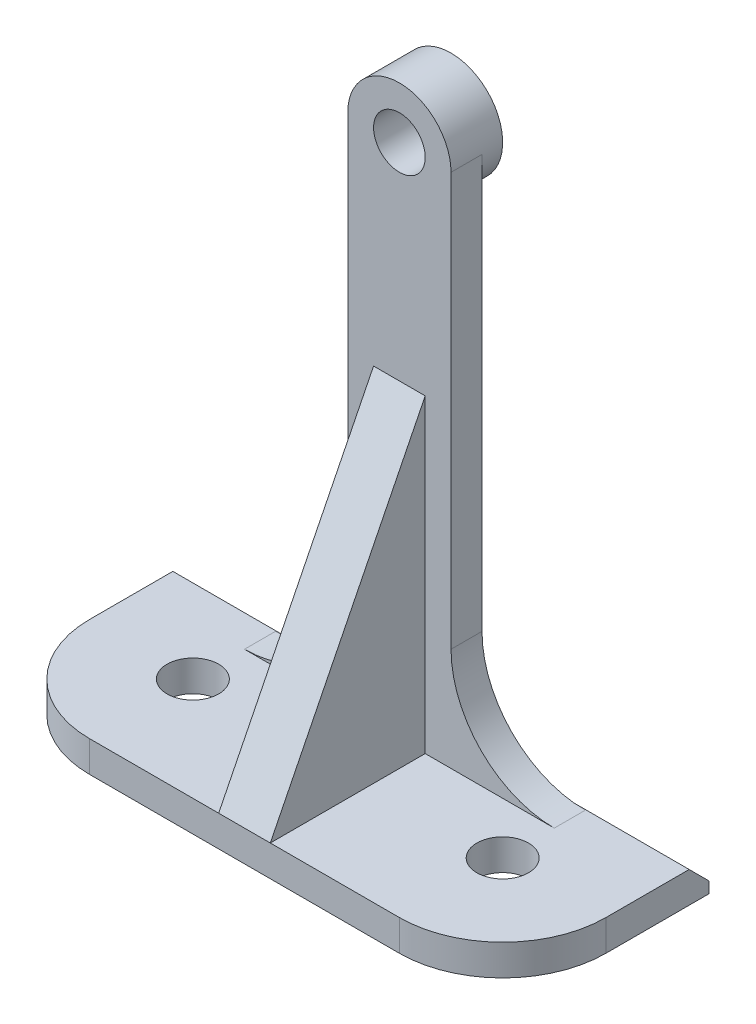
ISO-10303-21;
HEADER;
FILE_DESCRIPTION(('STEP AP214'),'2;1');
FILE_NAME('part.step','',(''),(''),'','','');
FILE_SCHEMA(('AUTOMOTIVE_DESIGN { 1 0 10303 214 1 1 1 1 }'));
ENDSEC;
DATA;
#1=APPLICATION_CONTEXT('core data for automotive mechanical design processes');
#2=APPLICATION_PROTOCOL_DEFINITION('international standard','automotive_design',2000,#1);
#3=PRODUCT_CONTEXT('',#1,'mechanical');
#4=PRODUCT('Part','Part','',(#3));
#5=PRODUCT_RELATED_PRODUCT_CATEGORY('part','',(#4));
#6=PRODUCT_DEFINITION_FORMATION('','',#4);
#7=PRODUCT_DEFINITION_CONTEXT('part definition',#1,'design');
#8=PRODUCT_DEFINITION('design','',#6,#7);
#9=PRODUCT_DEFINITION_SHAPE('','',#8);
#10=(LENGTH_UNIT() NAMED_UNIT(*) SI_UNIT(.MILLI.,.METRE.));
#11=(NAMED_UNIT(*) PLANE_ANGLE_UNIT() SI_UNIT($,.RADIAN.));
#12=(NAMED_UNIT(*) SI_UNIT($,.STERADIAN.) SOLID_ANGLE_UNIT());
#13=UNCERTAINTY_MEASURE_WITH_UNIT(LENGTH_MEASURE(1.E-05),#10,'distance_accuracy_value','');
#14=(GEOMETRIC_REPRESENTATION_CONTEXT(3) GLOBAL_UNCERTAINTY_ASSIGNED_CONTEXT((#13)) GLOBAL_UNIT_ASSIGNED_CONTEXT((#10,
#11,#12)) REPRESENTATION_CONTEXT('',''));
#15=CARTESIAN_POINT('',(0.,0.,0.));
#16=DIRECTION('',(0.,0.,1.));
#17=DIRECTION('',(1.,0.,0.));
#18=AXIS2_PLACEMENT_3D('',#15,#16,#17);
#19=CARTESIAN_POINT('',(0.,0.,-20.32));
#20=DIRECTION('',(0.,0.,-1.));
#21=DIRECTION('',(-1.,0.,0.));
#22=AXIS2_PLACEMENT_3D('',#19,#20,#21);
#23=PLANE('',#22);
#24=CARTESIAN_POINT('',(38.1,33.02,-20.32));
#25=DIRECTION('',(0.,0.,-1.));
#26=DIRECTION('',(-1.,0.,0.));
#27=AXIS2_PLACEMENT_3D('',#24,#25,#26);
#28=CIRCLE('',#27,25.4);
#29=CARTESIAN_POINT('',(12.7,33.02,-20.32));
#30=VERTEX_POINT('',#29);
#31=CARTESIAN_POINT('',(38.1,7.62,-20.32));
#32=VERTEX_POINT('',#31);
#33=EDGE_CURVE('E226',#30,#32,#28,.F.);
#34=ORIENTED_EDGE('',*,*,#33,.T.);
#35=DIRECTION('',(1.,0.,0.));
#36=VECTOR('',#35,1.);
#37=CARTESIAN_POINT('',(0.,7.62,-20.32));
#38=LINE('',#37,#36);
#39=CARTESIAN_POINT('',(-38.1,7.62,-20.32));
#40=VERTEX_POINT('',#39);
#41=EDGE_CURVE('E276',#40,#32,#38,.T.);
#42=ORIENTED_EDGE('',*,*,#41,.F.);
#43=CARTESIAN_POINT('',(-38.1,33.02,-20.32));
#44=DIRECTION('',(0.,0.,-1.));
#45=DIRECTION('',(-1.,0.,0.));
#46=AXIS2_PLACEMENT_3D('',#43,#44,#45);
#47=CIRCLE('',#46,25.4);
#48=CARTESIAN_POINT('',(-12.7,33.02,-20.32));
#49=VERTEX_POINT('',#48);
#50=EDGE_CURVE('E270',#40,#49,#47,.F.);
#51=ORIENTED_EDGE('',*,*,#50,.T.);
#52=DIRECTION('',(0.,-1.,0.));
#53=VECTOR('',#52,1.);
#54=CARTESIAN_POINT('',(-12.7,0.,-20.32));
#55=LINE('',#54,#53);
#56=CARTESIAN_POINT('',(-12.7,134.62,-20.32));
#57=VERTEX_POINT('',#56);
#58=EDGE_CURVE('E289',#57,#49,#55,.T.);
#59=ORIENTED_EDGE('',*,*,#58,.F.);
#60=CARTESIAN_POINT('',(0.,134.62,-20.32));
#61=DIRECTION('',(0.,0.,-1.));
#62=DIRECTION('',(-1.,0.,0.));
#63=AXIS2_PLACEMENT_3D('',#60,#61,#62);
#64=CIRCLE('',#63,12.7);
#65=CARTESIAN_POINT('',(12.7,134.62,-20.32));
#66=VERTEX_POINT('',#65);
#67=EDGE_CURVE('E257',#57,#66,#64,.F.);
#68=ORIENTED_EDGE('',*,*,#67,.T.);
#69=DIRECTION('',(0.,-1.,0.));
#70=VECTOR('',#69,1.);
#71=CARTESIAN_POINT('',(12.7,0.,-20.32));
#72=LINE('',#71,#70);
#73=EDGE_CURVE('E278',#66,#30,#72,.T.);
#74=ORIENTED_EDGE('',*,*,#73,.T.);
#75=EDGE_LOOP('',(#34,#42,#51,#59,#68,#74));
#76=FACE_BOUND('',#75,.T.);
#77=ADVANCED_FACE('F80',(#76),#23,.T.);
#78=CARTESIAN_POINT('',(38.1,7.62,0.));
#79=DIRECTION('',(0.,1.,0.));
#80=DIRECTION('',(0.,0.,1.));
#81=AXIS2_PLACEMENT_3D('',#78,#79,#80);
#82=PLANE('',#81);
#83=DIRECTION('',(0.,0.,1.));
#84=VECTOR('',#83,1.);
#85=CARTESIAN_POINT('',(63.5,7.62,-25.4));
#86=LINE('',#85,#84);
#87=CARTESIAN_POINT('',(63.5,7.62,-20.48));
#88=VERTEX_POINT('',#87);
#89=CARTESIAN_POINT('',(63.5,7.62,0.));
#90=VERTEX_POINT('',#89);
#91=EDGE_CURVE('E311',#88,#90,#86,.T.);
#92=ORIENTED_EDGE('',*,*,#91,.F.);
#93=DIRECTION('',(-1.,0.,0.));
#94=VECTOR('',#93,1.);
#95=CARTESIAN_POINT('',(38.1,7.62,-20.48));
#96=LINE('',#95,#94);
#97=CARTESIAN_POINT('',(-63.5,7.62,-20.48));
#98=VERTEX_POINT('',#97);
#99=EDGE_CURVE('E89',#88,#98,#96,.T.);
#100=ORIENTED_EDGE('',*,*,#99,.T.);
#101=DIRECTION('',(0.,0.,1.));
#102=VECTOR('',#101,1.);
#103=CARTESIAN_POINT('',(-63.5,7.62,-25.4));
#104=LINE('',#103,#102);
#105=CARTESIAN_POINT('',(-63.5,7.62,0.));
#106=VERTEX_POINT('',#105);
#107=EDGE_CURVE('E249',#98,#106,#104,.T.);
#108=ORIENTED_EDGE('',*,*,#107,.T.);
#109=CARTESIAN_POINT('',(-38.1,7.62,0.));
#110=DIRECTION('',(0.,1.,0.));
#111=DIRECTION('',(0.,0.,1.));
#112=AXIS2_PLACEMENT_3D('',#109,#110,#111);
#113=CIRCLE('',#112,25.4);
#114=CARTESIAN_POINT('',(-38.1,7.62,25.4));
#115=VERTEX_POINT('',#114);
#116=EDGE_CURVE('E253',#106,#115,#113,.T.);
#117=ORIENTED_EDGE('',*,*,#116,.T.);
#118=DIRECTION('',(1.,0.,0.));
#119=VECTOR('',#118,1.);
#120=CARTESIAN_POINT('',(-38.1,7.62,25.4));
#121=LINE('',#120,#119);
#122=CARTESIAN_POINT('',(-6.35,7.62,25.4));
#123=VERTEX_POINT('',#122);
#124=EDGE_CURVE('E212',#115,#123,#121,.T.);
#125=ORIENTED_EDGE('',*,*,#124,.T.);
#126=DIRECTION('',(0.,0.,-1.));
#127=VECTOR('',#126,1.);
#128=CARTESIAN_POINT('',(-6.35,7.62,0.));
#129=LINE('',#128,#127);
#130=CARTESIAN_POINT('',(-6.35,7.62,-12.7));
#131=VERTEX_POINT('',#130);
#132=EDGE_CURVE('E208',#123,#131,#129,.T.);
#133=ORIENTED_EDGE('',*,*,#132,.T.);
#134=DIRECTION('',(1.,0.,0.));
#135=VECTOR('',#134,1.);
#136=CARTESIAN_POINT('',(0.,7.62,-12.7));
#137=LINE('',#136,#135);
#138=CARTESIAN_POINT('',(-38.1,7.62,-12.7));
#139=VERTEX_POINT('',#138);
#140=EDGE_CURVE('E191',#139,#131,#137,.T.);
#141=ORIENTED_EDGE('',*,*,#140,.F.);
#142=DIRECTION('',(0.,0.,-1.));
#143=VECTOR('',#142,1.);
#144=CARTESIAN_POINT('',(-38.1,7.62,0.));
#145=LINE('',#144,#143);
#146=EDGE_CURVE('E263',#139,#40,#145,.T.);
#147=ORIENTED_EDGE('',*,*,#146,.T.);
#148=ORIENTED_EDGE('',*,*,#41,.T.);
#149=DIRECTION('',(0.,0.,-1.));
#150=VECTOR('',#149,1.);
#151=CARTESIAN_POINT('',(38.1,7.62,-12.7));
#152=LINE('',#151,#150);
#153=CARTESIAN_POINT('',(38.1,7.62,-12.7));
#154=VERTEX_POINT('',#153);
#155=EDGE_CURVE('E260',#32,#154,#152,.F.);
#156=ORIENTED_EDGE('',*,*,#155,.T.);
#157=CARTESIAN_POINT('',(6.35,7.62,-12.7));
#158=VERTEX_POINT('',#157);
#159=EDGE_CURVE('E204',#158,#154,#137,.T.);
#160=ORIENTED_EDGE('',*,*,#159,.F.);
#161=DIRECTION('',(0.,0.,-1.));
#162=VECTOR('',#161,1.);
#163=CARTESIAN_POINT('',(6.35,7.62,0.));
#164=LINE('',#163,#162);
#165=CARTESIAN_POINT('',(6.35,7.62,25.4));
#166=VERTEX_POINT('',#165);
#167=EDGE_CURVE('E216',#166,#158,#164,.T.);
#168=ORIENTED_EDGE('',*,*,#167,.F.);
#169=CARTESIAN_POINT('',(38.1,7.62,25.4));
#170=VERTEX_POINT('',#169);
#171=EDGE_CURVE('E317',#166,#170,#121,.T.);
#172=ORIENTED_EDGE('',*,*,#171,.T.);
#173=CARTESIAN_POINT('',(38.1,7.62,0.));
#174=DIRECTION('',(0.,1.,0.));
#175=DIRECTION('',(0.,0.,1.));
#176=AXIS2_PLACEMENT_3D('',#173,#174,#175);
#177=CIRCLE('',#176,25.4);
#178=EDGE_CURVE('E313',#170,#90,#177,.T.);
#179=ORIENTED_EDGE('',*,*,#178,.T.);
#180=EDGE_LOOP('',(#92,#100,#108,#117,#125,#133,#141,#147,#148,#156,#160,#168,#172,#179));
#181=FACE_BOUND('',#180,.T.);
#182=CARTESIAN_POINT('',(38.1,7.62,0.));
#183=DIRECTION('',(0.,1.,0.));
#184=DIRECTION('',(0.,0.,1.));
#185=AXIS2_PLACEMENT_3D('',#182,#183,#184);
#186=CIRCLE('',#185,6.35);
#187=CARTESIAN_POINT('',(38.1,7.62,-6.35000000000001));
#188=VERTEX_POINT('',#187);
#189=EDGE_CURVE('E299',#188,#188,#186,.T.);
#190=ORIENTED_EDGE('',*,*,#189,.F.);
#191=EDGE_LOOP('',(#190));
#192=FACE_BOUND('',#191,.T.);
#193=CARTESIAN_POINT('',(-38.1,7.62,0.));
#194=DIRECTION('',(0.,1.,0.));
#195=DIRECTION('',(0.,0.,1.));
#196=AXIS2_PLACEMENT_3D('',#193,#194,#195);
#197=CIRCLE('',#196,6.35);
#198=CARTESIAN_POINT('',(-38.1,7.62,-6.35000000000001));
#199=VERTEX_POINT('',#198);
#200=EDGE_CURVE('E305',#199,#199,#197,.T.);
#201=ORIENTED_EDGE('',*,*,#200,.F.);
#202=EDGE_LOOP('',(#201));
#203=FACE_BOUND('',#202,.T.);
#204=ADVANCED_FACE('F209',(#181,#192,#203),#82,.T.);
#205=CARTESIAN_POINT('',(38.1,0.,0.));
#206=DIRECTION('',(0.,1.,0.));
#207=DIRECTION('',(0.,0.,1.));
#208=AXIS2_PLACEMENT_3D('',#205,#206,#207);
#209=PLANE('',#208);
#210=CARTESIAN_POINT('',(38.1,0.,0.));
#211=DIRECTION('',(0.,1.,0.));
#212=DIRECTION('',(0.,0.,1.));
#213=AXIS2_PLACEMENT_3D('',#210,#211,#212);
#214=CIRCLE('',#213,25.4);
#215=CARTESIAN_POINT('',(38.1,0.,25.4));
#216=VERTEX_POINT('',#215);
#217=CARTESIAN_POINT('',(63.5,0.,0.));
#218=VERTEX_POINT('',#217);
#219=EDGE_CURVE('E322',#216,#218,#214,.T.);
#220=ORIENTED_EDGE('',*,*,#219,.F.);
#221=DIRECTION('',(1.,0.,0.));
#222=VECTOR('',#221,1.);
#223=CARTESIAN_POINT('',(-38.1,0.,25.4));
#224=LINE('',#223,#222);
#225=CARTESIAN_POINT('',(-38.1,0.,25.4));
#226=VERTEX_POINT('',#225);
#227=EDGE_CURVE('E325',#226,#216,#224,.T.);
#228=ORIENTED_EDGE('',*,*,#227,.F.);
#229=CARTESIAN_POINT('',(-38.1,0.,0.));
#230=DIRECTION('',(0.,1.,0.));
#231=DIRECTION('',(0.,0.,1.));
#232=AXIS2_PLACEMENT_3D('',#229,#230,#231);
#233=CIRCLE('',#232,25.4);
#234=CARTESIAN_POINT('',(-63.5,0.,0.));
#235=VERTEX_POINT('',#234);
#236=EDGE_CURVE('E327',#235,#226,#233,.T.);
#237=ORIENTED_EDGE('',*,*,#236,.F.);
#238=DIRECTION('',(0.,0.,1.));
#239=VECTOR('',#238,1.);
#240=CARTESIAN_POINT('',(-63.5,0.,-25.4));
#241=LINE('',#240,#239);
#242=CARTESIAN_POINT('',(-63.5,0.,-25.4));
#243=VERTEX_POINT('',#242);
#244=EDGE_CURVE('E314',#243,#235,#241,.T.);
#245=ORIENTED_EDGE('',*,*,#244,.F.);
#246=DIRECTION('',(1.,0.,0.));
#247=VECTOR('',#246,1.);
#248=CARTESIAN_POINT('',(-63.5,0.,-25.4));
#249=LINE('',#248,#247);
#250=CARTESIAN_POINT('',(63.5,0.,-25.4));
#251=VERTEX_POINT('',#250);
#252=EDGE_CURVE('E308',#243,#251,#249,.T.);
#253=ORIENTED_EDGE('',*,*,#252,.T.);
#254=DIRECTION('',(0.,0.,1.));
#255=VECTOR('',#254,1.);
#256=CARTESIAN_POINT('',(63.5,0.,-25.4));
#257=LINE('',#256,#255);
#258=EDGE_CURVE('E247',#251,#218,#257,.T.);
#259=ORIENTED_EDGE('',*,*,#258,.T.);
#260=EDGE_LOOP('',(#220,#228,#237,#245,#253,#259));
#261=FACE_BOUND('',#260,.T.);
#262=CARTESIAN_POINT('',(38.1,0.,0.));
#263=DIRECTION('',(0.,1.,0.));
#264=DIRECTION('',(0.,0.,1.));
#265=AXIS2_PLACEMENT_3D('',#262,#263,#264);
#266=CIRCLE('',#265,6.35);
#267=CARTESIAN_POINT('',(38.1,0.,-6.35000000000001));
#268=VERTEX_POINT('',#267);
#269=EDGE_CURVE('E296',#268,#268,#266,.T.);
#270=ORIENTED_EDGE('',*,*,#269,.T.);
#271=EDGE_LOOP('',(#270));
#272=FACE_BOUND('',#271,.T.);
#273=CARTESIAN_POINT('',(-38.1,0.,0.));
#274=DIRECTION('',(0.,1.,0.));
#275=DIRECTION('',(0.,0.,1.));
#276=AXIS2_PLACEMENT_3D('',#273,#274,#275);
#277=CIRCLE('',#276,6.35);
#278=CARTESIAN_POINT('',(-38.1,0.,-6.35000000000001));
#279=VERTEX_POINT('',#278);
#280=EDGE_CURVE('E302',#279,#279,#277,.T.);
#281=ORIENTED_EDGE('',*,*,#280,.T.);
#282=EDGE_LOOP('',(#281));
#283=FACE_BOUND('',#282,.T.);
#284=ADVANCED_FACE('F347',(#261,#272,#283),#209,.F.);
#285=CARTESIAN_POINT('',(-63.5,7.62,-25.4));
#286=DIRECTION('',(0.,0.,-1.));
#287=DIRECTION('',(-1.,0.,0.));
#288=AXIS2_PLACEMENT_3D('',#285,#286,#287);
#289=PLANE('',#288);
#290=DIRECTION('',(0.,-1.,0.));
#291=VECTOR('',#290,1.);
#292=CARTESIAN_POINT('',(-63.5,7.62,-25.4));
#293=LINE('',#292,#291);
#294=CARTESIAN_POINT('',(-63.5,2.70000000000002,-25.4));
#295=VERTEX_POINT('',#294);
#296=EDGE_CURVE('E241',#295,#243,#293,.T.);
#297=ORIENTED_EDGE('',*,*,#296,.F.);
#298=DIRECTION('',(1.,0.,0.));
#299=VECTOR('',#298,1.);
#300=CARTESIAN_POINT('',(-63.5,2.70000000000002,-25.4));
#301=LINE('',#300,#299);
#302=CARTESIAN_POINT('',(63.5,2.70000000000002,-25.4));
#303=VERTEX_POINT('',#302);
#304=EDGE_CURVE('E231',#295,#303,#301,.T.);
#305=ORIENTED_EDGE('',*,*,#304,.T.);
#306=DIRECTION('',(0.,-1.,0.));
#307=VECTOR('',#306,1.);
#308=CARTESIAN_POINT('',(63.5,7.62,-25.4));
#309=LINE('',#308,#307);
#310=EDGE_CURVE('E239',#303,#251,#309,.T.);
#311=ORIENTED_EDGE('',*,*,#310,.T.);
#312=ORIENTED_EDGE('',*,*,#252,.F.);
#313=EDGE_LOOP('',(#297,#305,#311,#312));
#314=FACE_BOUND('',#313,.T.);
#315=ADVANCED_FACE('F237',(#314),#289,.T.);
#316=CARTESIAN_POINT('',(-63.5,7.62,-25.4));
#317=DIRECTION('',(1.,0.,0.));
#318=DIRECTION('',(0.,0.,-1.));
#319=AXIS2_PLACEMENT_3D('',#316,#317,#318);
#320=PLANE('',#319);
#321=ORIENTED_EDGE('',*,*,#107,.F.);
#322=DIRECTION('',(0.,0.707106781186548,0.707106781186547));
#323=VECTOR('',#322,1.);
#324=CARTESIAN_POINT('',(-63.5,2.70000000000002,-25.4));
#325=LINE('',#324,#323);
#326=EDGE_CURVE('E12',#98,#295,#325,.F.);
#327=ORIENTED_EDGE('',*,*,#326,.T.);
#328=ORIENTED_EDGE('',*,*,#296,.T.);
#329=ORIENTED_EDGE('',*,*,#244,.T.);
#330=DIRECTION('',(0.,-1.,0.));
#331=VECTOR('',#330,1.);
#332=CARTESIAN_POINT('',(-63.5,7.62,0.));
#333=LINE('',#332,#331);
#334=EDGE_CURVE('E331',#106,#235,#333,.T.);
#335=ORIENTED_EDGE('',*,*,#334,.F.);
#336=EDGE_LOOP('',(#321,#327,#328,#329,#335));
#337=FACE_BOUND('',#336,.T.);
#338=ADVANCED_FACE('F353',(#337),#320,.F.);
#339=CARTESIAN_POINT('',(-38.1,7.62,0.));
#340=DIRECTION('',(0.,-1.,0.));
#341=DIRECTION('',(0.,0.,-1.));
#342=AXIS2_PLACEMENT_3D('',#339,#340,#341);
#343=CYLINDRICAL_SURFACE('',#342,25.4);
#344=ORIENTED_EDGE('',*,*,#236,.T.);
#345=DIRECTION('',(0.,-1.,0.));
#346=VECTOR('',#345,1.);
#347=CARTESIAN_POINT('',(-38.1,7.62,25.4));
#348=LINE('',#347,#346);
#349=EDGE_CURVE('E334',#115,#226,#348,.T.);
#350=ORIENTED_EDGE('',*,*,#349,.F.);
#351=ORIENTED_EDGE('',*,*,#116,.F.);
#352=ORIENTED_EDGE('',*,*,#334,.T.);
#353=EDGE_LOOP('',(#344,#350,#351,#352));
#354=FACE_BOUND('',#353,.T.);
#355=ADVANCED_FACE('F356',(#354),#343,.T.);
#356=CARTESIAN_POINT('',(-38.1,7.62,25.4));
#357=DIRECTION('',(0.,0.,-1.));
#358=DIRECTION('',(-1.,0.,0.));
#359=AXIS2_PLACEMENT_3D('',#356,#357,#358);
#360=PLANE('',#359);
#361=ORIENTED_EDGE('',*,*,#171,.F.);
#362=DIRECTION('',(-1.,0.,0.));
#363=VECTOR('',#362,1.);
#364=CARTESIAN_POINT('',(-38.1,7.62000000000001,25.4));
#365=LINE('',#364,#363);
#366=EDGE_CURVE('E443',#123,#166,#365,.F.);
#367=ORIENTED_EDGE('',*,*,#366,.F.);
#368=ORIENTED_EDGE('',*,*,#124,.F.);
#369=ORIENTED_EDGE('',*,*,#349,.T.);
#370=ORIENTED_EDGE('',*,*,#227,.T.);
#371=DIRECTION('',(0.,-1.,0.));
#372=VECTOR('',#371,1.);
#373=CARTESIAN_POINT('',(38.1,7.62,25.4));
#374=LINE('',#373,#372);
#375=EDGE_CURVE('E251',#170,#216,#374,.T.);
#376=ORIENTED_EDGE('',*,*,#375,.F.);
#377=EDGE_LOOP('',(#361,#367,#368,#369,#370,#376));
#378=FACE_BOUND('',#377,.T.);
#379=ADVANCED_FACE('F403',(#378),#360,.F.);
#380=CARTESIAN_POINT('',(38.1,7.62,0.));
#381=DIRECTION('',(0.,-1.,0.));
#382=DIRECTION('',(0.,0.,-1.));
#383=AXIS2_PLACEMENT_3D('',#380,#381,#382);
#384=CYLINDRICAL_SURFACE('',#383,25.4);
#385=ORIENTED_EDGE('',*,*,#219,.T.);
#386=DIRECTION('',(0.,-1.,0.));
#387=VECTOR('',#386,1.);
#388=CARTESIAN_POINT('',(63.5,7.62,0.));
#389=LINE('',#388,#387);
#390=EDGE_CURVE('E248',#90,#218,#389,.T.);
#391=ORIENTED_EDGE('',*,*,#390,.F.);
#392=ORIENTED_EDGE('',*,*,#178,.F.);
#393=ORIENTED_EDGE('',*,*,#375,.T.);
#394=EDGE_LOOP('',(#385,#391,#392,#393));
#395=FACE_BOUND('',#394,.T.);
#396=ADVANCED_FACE('F341',(#395),#384,.T.);
#397=CARTESIAN_POINT('',(63.5,7.62,-25.4));
#398=DIRECTION('',(1.,0.,0.));
#399=DIRECTION('',(0.,0.,-1.));
#400=AXIS2_PLACEMENT_3D('',#397,#398,#399);
#401=PLANE('',#400);
#402=ORIENTED_EDGE('',*,*,#310,.F.);
#403=DIRECTION('',(0.,-0.707106781186548,-0.707106781186547));
#404=VECTOR('',#403,1.);
#405=CARTESIAN_POINT('',(63.5,5.16000000000001,-22.94));
#406=LINE('',#405,#404);
#407=EDGE_CURVE('E103',#303,#88,#406,.F.);
#408=ORIENTED_EDGE('',*,*,#407,.T.);
#409=ORIENTED_EDGE('',*,*,#91,.T.);
#410=ORIENTED_EDGE('',*,*,#390,.T.);
#411=ORIENTED_EDGE('',*,*,#258,.F.);
#412=EDGE_LOOP('',(#402,#408,#409,#410,#411));
#413=FACE_BOUND('',#412,.T.);
#414=ADVANCED_FACE('F245',(#413),#401,.T.);
#415=CARTESIAN_POINT('',(-38.1,7.62,0.));
#416=DIRECTION('',(0.,-1.,0.));
#417=DIRECTION('',(0.,0.,-1.));
#418=AXIS2_PLACEMENT_3D('',#415,#416,#417);
#419=CYLINDRICAL_SURFACE('',#418,6.35);
#420=CARTESIAN_POINT('',(-38.1,7.62,-6.35000000000001));
#421=CARTESIAN_POINT('',(-38.1,7.540625,-6.35000000000001));
#422=CARTESIAN_POINT('',(-38.1,7.46125,-6.35000000000001));
#423=CARTESIAN_POINT('',(-38.1,7.3025,-6.35000000000001));
#424=CARTESIAN_POINT('',(-38.1,7.223125,-6.35000000000001));
#425=CARTESIAN_POINT('',(-38.1,7.064375,-6.35000000000001));
#426=CARTESIAN_POINT('',(-38.1,6.985,-6.35000000000001));
#427=CARTESIAN_POINT('',(-38.1,6.82625,-6.35000000000001));
#428=CARTESIAN_POINT('',(-38.1,6.746875,-6.35000000000001));
#429=CARTESIAN_POINT('',(-38.1,6.588125,-6.35000000000001));
#430=CARTESIAN_POINT('',(-38.1,6.50875,-6.35000000000001));
#431=CARTESIAN_POINT('',(-38.1,6.35,-6.35000000000001));
#432=CARTESIAN_POINT('',(-38.1,6.270625,-6.35000000000001));
#433=CARTESIAN_POINT('',(-38.1,6.111875,-6.35000000000001));
#434=CARTESIAN_POINT('',(-38.1,6.0325,-6.35000000000001));
#435=CARTESIAN_POINT('',(-38.1,5.87375,-6.35000000000001));
#436=CARTESIAN_POINT('',(-38.1,5.794375,-6.35000000000001));
#437=CARTESIAN_POINT('',(-38.1,5.635625,-6.35000000000001));
#438=CARTESIAN_POINT('',(-38.1,5.55625,-6.35000000000001));
#439=CARTESIAN_POINT('',(-38.1,5.3975,-6.35000000000001));
#440=CARTESIAN_POINT('',(-38.1,5.318125,-6.35000000000001));
#441=CARTESIAN_POINT('',(-38.1,5.159375,-6.35000000000001));
#442=CARTESIAN_POINT('',(-38.1,5.08,-6.35000000000001));
#443=CARTESIAN_POINT('',(-38.1,4.92125,-6.35000000000001));
#444=CARTESIAN_POINT('',(-38.1,4.841875,-6.35000000000001));
#445=CARTESIAN_POINT('',(-38.1,4.683125,-6.35000000000001));
#446=CARTESIAN_POINT('',(-38.1,4.60375,-6.35000000000001));
#447=CARTESIAN_POINT('',(-38.1,4.445,-6.35000000000001));
#448=CARTESIAN_POINT('',(-38.1,4.365625,-6.35000000000001));
#449=CARTESIAN_POINT('',(-38.1,4.206875,-6.35000000000001));
#450=CARTESIAN_POINT('',(-38.1,4.1275,-6.35000000000001));
#451=CARTESIAN_POINT('',(-38.1,3.96875,-6.35000000000001));
#452=CARTESIAN_POINT('',(-38.1,3.889375,-6.35000000000001));
#453=CARTESIAN_POINT('',(-38.1,3.730625,-6.35000000000001));
#454=CARTESIAN_POINT('',(-38.1,3.65125,-6.35000000000001));
#455=CARTESIAN_POINT('',(-38.1,3.4925,-6.35000000000001));
#456=CARTESIAN_POINT('',(-38.1,3.413125,-6.35000000000001));
#457=CARTESIAN_POINT('',(-38.1,3.254375,-6.35000000000001));
#458=CARTESIAN_POINT('',(-38.1,3.175,-6.35000000000001));
#459=CARTESIAN_POINT('',(-38.1,3.01625,-6.35000000000001));
#460=CARTESIAN_POINT('',(-38.1,2.936875,-6.35000000000001));
#461=CARTESIAN_POINT('',(-38.1,2.778125,-6.35000000000001));
#462=CARTESIAN_POINT('',(-38.1,2.69875,-6.35000000000001));
#463=CARTESIAN_POINT('',(-38.1,2.54,-6.35000000000001));
#464=CARTESIAN_POINT('',(-38.1,2.460625,-6.35000000000001));
#465=CARTESIAN_POINT('',(-38.1,2.301875,-6.35000000000001));
#466=CARTESIAN_POINT('',(-38.1,2.2225,-6.35000000000001));
#467=CARTESIAN_POINT('',(-38.1,2.06375,-6.35000000000001));
#468=CARTESIAN_POINT('',(-38.1,1.984375,-6.35000000000001));
#469=CARTESIAN_POINT('',(-38.1,1.825625,-6.35000000000001));
#470=CARTESIAN_POINT('',(-38.1,1.74625,-6.35000000000001));
#471=CARTESIAN_POINT('',(-38.1,1.5875,-6.35000000000001));
#472=CARTESIAN_POINT('',(-38.1,1.508125,-6.35000000000001));
#473=CARTESIAN_POINT('',(-38.1,1.349375,-6.35000000000001));
#474=CARTESIAN_POINT('',(-38.1,1.27,-6.35000000000001));
#475=CARTESIAN_POINT('',(-38.1,1.11125,-6.35000000000001));
#476=CARTESIAN_POINT('',(-38.1,1.031875,-6.35000000000001));
#477=CARTESIAN_POINT('',(-38.1,0.873125,-6.35000000000001));
#478=CARTESIAN_POINT('',(-38.1,0.79375,-6.35000000000001));
#479=CARTESIAN_POINT('',(-38.1,0.635,-6.35000000000001));
#480=CARTESIAN_POINT('',(-38.1,0.555625,-6.35000000000001));
#481=CARTESIAN_POINT('',(-38.1,0.396875,-6.35000000000001));
#482=CARTESIAN_POINT('',(-38.1,0.3175,-6.35000000000001));
#483=CARTESIAN_POINT('',(-38.1,0.15875,-6.35000000000001));
#484=CARTESIAN_POINT('',(-38.1,0.0793749999999999,-6.35000000000001));
#485=CARTESIAN_POINT('',(-38.1,0.,-6.35000000000001));
#486=B_SPLINE_CURVE_WITH_KNOTS('',3,(#420,#421,#422,#423,#424,#425,#426,#427,#428,#429,#430,
#431,#432,#433,#434,#435,#436,#437,#438,#439,#440,#441,#442,#443,#444,#445,#446,#447,#448,#449,
#450,#451,#452,#453,#454,#455,#456,#457,#458,#459,#460,#461,#462,#463,#464,#465,#466,#467,#468,
#469,#470,#471,#472,#473,#474,#475,#476,#477,#478,#479,#480,#481,#482,#483,#484,#485),
.UNSPECIFIED.,.F.,.F.,(4,2,2,2,2,2,2,2,2,2,2,2,2,2,2,2,2,2,2,2,2,2,2,2,2,2,2,2,2,2,2,2,4),(0.,
0.238125,0.476249999999999,0.714375,0.952499999999999,1.190625,1.42875,1.666875,1.905,2.143125,
2.38125,2.619375,2.8575,3.095625,3.33375,3.571875,3.81,4.048125,4.28625,4.524375,4.7625,
5.000625,5.23875,5.476875,5.715,5.953125,6.19125,6.429375,6.6675,6.905625,7.14375,7.381875,
7.62),.UNSPECIFIED.);
#487=EDGE_CURVE('BSEAM392',#199,#279,#486,.T.);
#488=ORIENTED_EDGE('',*,*,#200,.T.);
#489=ORIENTED_EDGE('',*,*,#280,.F.);
#490=ORIENTED_EDGE('',*,*,#487,.T.);
#491=ORIENTED_EDGE('',*,*,#487,.F.);
#492=EDGE_LOOP('',(#488,#490,#489,#491));
#493=FACE_BOUND('',#492,.T.);
#494=ADVANCED_FACE('F392',(#493),#419,.F.);
#495=CARTESIAN_POINT('',(38.1,7.62,0.));
#496=DIRECTION('',(0.,-1.,0.));
#497=DIRECTION('',(0.,0.,-1.));
#498=AXIS2_PLACEMENT_3D('',#495,#496,#497);
#499=CYLINDRICAL_SURFACE('',#498,6.35);
#500=CARTESIAN_POINT('',(38.1,7.62,-6.35000000000001));
#501=CARTESIAN_POINT('',(38.1,7.540625,-6.35000000000001));
#502=CARTESIAN_POINT('',(38.1,7.46125,-6.35000000000001));
#503=CARTESIAN_POINT('',(38.1,7.3025,-6.35000000000001));
#504=CARTESIAN_POINT('',(38.1,7.223125,-6.35000000000001));
#505=CARTESIAN_POINT('',(38.1,7.064375,-6.35000000000001));
#506=CARTESIAN_POINT('',(38.1,6.985,-6.35000000000001));
#507=CARTESIAN_POINT('',(38.1,6.82625,-6.35000000000001));
#508=CARTESIAN_POINT('',(38.1,6.746875,-6.35000000000001));
#509=CARTESIAN_POINT('',(38.1,6.588125,-6.35000000000001));
#510=CARTESIAN_POINT('',(38.1,6.50875,-6.35000000000001));
#511=CARTESIAN_POINT('',(38.1,6.35,-6.35000000000001));
#512=CARTESIAN_POINT('',(38.1,6.270625,-6.35000000000001));
#513=CARTESIAN_POINT('',(38.1,6.111875,-6.35000000000001));
#514=CARTESIAN_POINT('',(38.1,6.0325,-6.35000000000001));
#515=CARTESIAN_POINT('',(38.1,5.87375,-6.35000000000001));
#516=CARTESIAN_POINT('',(38.1,5.794375,-6.35000000000001));
#517=CARTESIAN_POINT('',(38.1,5.635625,-6.35000000000001));
#518=CARTESIAN_POINT('',(38.1,5.55625,-6.35000000000001));
#519=CARTESIAN_POINT('',(38.1,5.3975,-6.35000000000001));
#520=CARTESIAN_POINT('',(38.1,5.318125,-6.35000000000001));
#521=CARTESIAN_POINT('',(38.1,5.159375,-6.35000000000001));
#522=CARTESIAN_POINT('',(38.1,5.08,-6.35000000000001));
#523=CARTESIAN_POINT('',(38.1,4.92125,-6.35000000000001));
#524=CARTESIAN_POINT('',(38.1,4.841875,-6.35000000000001));
#525=CARTESIAN_POINT('',(38.1,4.683125,-6.35000000000001));
#526=CARTESIAN_POINT('',(38.1,4.60375,-6.35000000000001));
#527=CARTESIAN_POINT('',(38.1,4.445,-6.35000000000001));
#528=CARTESIAN_POINT('',(38.1,4.365625,-6.35000000000001));
#529=CARTESIAN_POINT('',(38.1,4.206875,-6.35000000000001));
#530=CARTESIAN_POINT('',(38.1,4.1275,-6.35000000000001));
#531=CARTESIAN_POINT('',(38.1,3.96875,-6.35000000000001));
#532=CARTESIAN_POINT('',(38.1,3.889375,-6.35000000000001));
#533=CARTESIAN_POINT('',(38.1,3.730625,-6.35000000000001));
#534=CARTESIAN_POINT('',(38.1,3.65125,-6.35000000000001));
#535=CARTESIAN_POINT('',(38.1,3.4925,-6.35000000000001));
#536=CARTESIAN_POINT('',(38.1,3.413125,-6.35000000000001));
#537=CARTESIAN_POINT('',(38.1,3.254375,-6.35000000000001));
#538=CARTESIAN_POINT('',(38.1,3.175,-6.35000000000001));
#539=CARTESIAN_POINT('',(38.1,3.01625,-6.35000000000001));
#540=CARTESIAN_POINT('',(38.1,2.936875,-6.35000000000001));
#541=CARTESIAN_POINT('',(38.1,2.778125,-6.35000000000001));
#542=CARTESIAN_POINT('',(38.1,2.69875,-6.35000000000001));
#543=CARTESIAN_POINT('',(38.1,2.54,-6.35000000000001));
#544=CARTESIAN_POINT('',(38.1,2.460625,-6.35000000000001));
#545=CARTESIAN_POINT('',(38.1,2.301875,-6.35000000000001));
#546=CARTESIAN_POINT('',(38.1,2.2225,-6.35000000000001));
#547=CARTESIAN_POINT('',(38.1,2.06375,-6.35000000000001));
#548=CARTESIAN_POINT('',(38.1,1.984375,-6.35000000000001));
#549=CARTESIAN_POINT('',(38.1,1.825625,-6.35000000000001));
#550=CARTESIAN_POINT('',(38.1,1.74625,-6.35000000000001));
#551=CARTESIAN_POINT('',(38.1,1.5875,-6.35000000000001));
#552=CARTESIAN_POINT('',(38.1,1.508125,-6.35000000000001));
#553=CARTESIAN_POINT('',(38.1,1.349375,-6.35000000000001));
#554=CARTESIAN_POINT('',(38.1,1.27,-6.35000000000001));
#555=CARTESIAN_POINT('',(38.1,1.11125,-6.35000000000001));
#556=CARTESIAN_POINT('',(38.1,1.031875,-6.35000000000001));
#557=CARTESIAN_POINT('',(38.1,0.873125,-6.35000000000001));
#558=CARTESIAN_POINT('',(38.1,0.79375,-6.35000000000001));
#559=CARTESIAN_POINT('',(38.1,0.635,-6.35000000000001));
#560=CARTESIAN_POINT('',(38.1,0.555625,-6.35000000000001));
#561=CARTESIAN_POINT('',(38.1,0.396875,-6.35000000000001));
#562=CARTESIAN_POINT('',(38.1,0.3175,-6.35000000000001));
#563=CARTESIAN_POINT('',(38.1,0.15875,-6.35000000000001));
#564=CARTESIAN_POINT('',(38.1,0.0793749999999999,-6.35000000000001));
#565=CARTESIAN_POINT('',(38.1,0.,-6.35000000000001));
#566=B_SPLINE_CURVE_WITH_KNOTS('',3,(#500,#501,#502,#503,#504,#505,#506,#507,#508,#509,#510,
#511,#512,#513,#514,#515,#516,#517,#518,#519,#520,#521,#522,#523,#524,#525,#526,#527,#528,#529,
#530,#531,#532,#533,#534,#535,#536,#537,#538,#539,#540,#541,#542,#543,#544,#545,#546,#547,#548,
#549,#550,#551,#552,#553,#554,#555,#556,#557,#558,#559,#560,#561,#562,#563,#564,#565),
.UNSPECIFIED.,.F.,.F.,(4,2,2,2,2,2,2,2,2,2,2,2,2,2,2,2,2,2,2,2,2,2,2,2,2,2,2,2,2,2,2,2,4),(0.,
0.238125,0.476249999999999,0.714375,0.952499999999999,1.190625,1.42875,1.666875,1.905,2.143125,
2.38125,2.619375,2.8575,3.095625,3.33375,3.571875,3.81,4.048125,4.28625,4.524375,4.7625,
5.000625,5.23875,5.476875,5.715,5.953125,6.19125,6.429375,6.6675,6.905625,7.14375,7.381875,
7.62),.UNSPECIFIED.);
#567=EDGE_CURVE('BSEAM388',#188,#268,#566,.T.);
#568=ORIENTED_EDGE('',*,*,#189,.T.);
#569=ORIENTED_EDGE('',*,*,#269,.F.);
#570=ORIENTED_EDGE('',*,*,#567,.T.);
#571=ORIENTED_EDGE('',*,*,#567,.F.);
#572=EDGE_LOOP('',(#568,#570,#569,#571));
#573=FACE_BOUND('',#572,.T.);
#574=ADVANCED_FACE('F388',(#573),#499,.F.);
#575=CARTESIAN_POINT('',(-12.7,0.,-12.7));
#576=DIRECTION('',(1.,0.,0.));
#577=DIRECTION('',(0.,1.,0.));
#578=AXIS2_PLACEMENT_3D('',#575,#576,#577);
#579=PLANE('',#578);
#580=ORIENTED_EDGE('',*,*,#58,.T.);
#581=DIRECTION('',(0.,0.,-1.));
#582=VECTOR('',#581,1.);
#583=CARTESIAN_POINT('',(-12.7,33.02,-12.7));
#584=LINE('',#583,#582);
#585=CARTESIAN_POINT('',(-12.7,33.02,-12.7));
#586=VERTEX_POINT('',#585);
#587=EDGE_CURVE('E265',#49,#586,#584,.F.);
#588=ORIENTED_EDGE('',*,*,#587,.T.);
#589=DIRECTION('',(0.,-1.,0.));
#590=VECTOR('',#589,1.);
#591=CARTESIAN_POINT('',(-12.7,0.,-12.7));
#592=LINE('',#591,#590);
#593=CARTESIAN_POINT('',(-12.7,134.62,-12.7));
#594=VERTEX_POINT('',#593);
#595=EDGE_CURVE('E285',#594,#586,#592,.T.);
#596=ORIENTED_EDGE('',*,*,#595,.F.);
#597=DIRECTION('',(0.,0.,-1.));
#598=VECTOR('',#597,1.);
#599=CARTESIAN_POINT('',(-12.7,134.62,-12.7));
#600=LINE('',#599,#598);
#601=EDGE_CURVE('E297',#594,#57,#600,.T.);
#602=ORIENTED_EDGE('',*,*,#601,.T.);
#603=EDGE_LOOP('',(#580,#588,#596,#602));
#604=FACE_BOUND('',#603,.T.);
#605=ADVANCED_FACE('F381',(#604),#579,.F.);
#606=CARTESIAN_POINT('',(12.7,0.,-12.7));
#607=DIRECTION('',(1.,0.,0.));
#608=DIRECTION('',(0.,1.,0.));
#609=AXIS2_PLACEMENT_3D('',#606,#607,#608);
#610=PLANE('',#609);
#611=DIRECTION('',(0.,-1.,0.));
#612=VECTOR('',#611,1.);
#613=CARTESIAN_POINT('',(12.7,0.,-12.7));
#614=LINE('',#613,#612);
#615=CARTESIAN_POINT('',(12.7,134.62,-12.7));
#616=VERTEX_POINT('',#615);
#617=CARTESIAN_POINT('',(12.7,33.02,-12.7));
#618=VERTEX_POINT('',#617);
#619=EDGE_CURVE('E449',#616,#618,#614,.T.);
#620=ORIENTED_EDGE('',*,*,#619,.T.);
#621=DIRECTION('',(0.,0.,-1.));
#622=VECTOR('',#621,1.);
#623=CARTESIAN_POINT('',(12.7,33.02,-20.32));
#624=LINE('',#623,#622);
#625=EDGE_CURVE('E267',#618,#30,#624,.T.);
#626=ORIENTED_EDGE('',*,*,#625,.T.);
#627=ORIENTED_EDGE('',*,*,#73,.F.);
#628=DIRECTION('',(0.,0.,-1.));
#629=VECTOR('',#628,1.);
#630=CARTESIAN_POINT('',(12.7,134.62,-12.7));
#631=LINE('',#630,#629);
#632=EDGE_CURVE('E293',#616,#66,#631,.T.);
#633=ORIENTED_EDGE('',*,*,#632,.F.);
#634=EDGE_LOOP('',(#620,#626,#627,#633));
#635=FACE_BOUND('',#634,.T.);
#636=ADVANCED_FACE('F378',(#635),#610,.T.);
#637=CARTESIAN_POINT('',(0.,134.62,-12.7));
#638=DIRECTION('',(0.,0.,-1.));
#639=DIRECTION('',(-1.,0.,0.));
#640=AXIS2_PLACEMENT_3D('',#637,#638,#639);
#641=CYLINDRICAL_SURFACE('',#640,12.7);
#642=ORIENTED_EDGE('',*,*,#632,.T.);
#643=ORIENTED_EDGE('',*,*,#67,.F.);
#644=ORIENTED_EDGE('',*,*,#601,.F.);
#645=CARTESIAN_POINT('',(0.,134.62,-12.7));
#646=DIRECTION('',(0.,0.,-1.));
#647=DIRECTION('',(-1.,0.,0.));
#648=AXIS2_PLACEMENT_3D('',#645,#646,#647);
#649=CIRCLE('',#648,12.7);
#650=EDGE_CURVE('E287',#594,#616,#649,.T.);
#651=ORIENTED_EDGE('',*,*,#650,.T.);
#652=EDGE_LOOP('',(#642,#643,#644,#651));
#653=FACE_BOUND('',#652,.T.);
#654=CARTESIAN_POINT('',(0.,134.62,-25.4));
#655=DIRECTION('',(0.,0.,-1.));
#656=DIRECTION('',(-1.,0.,0.));
#657=AXIS2_PLACEMENT_3D('',#654,#655,#656);
#658=CIRCLE('',#657,12.7);
#659=CARTESIAN_POINT('',(-12.7,134.62,-25.4));
#660=VERTEX_POINT('',#659);
#661=EDGE_CURVE('E439',#660,#660,#658,.T.);
#662=ORIENTED_EDGE('',*,*,#661,.F.);
#663=EDGE_LOOP('',(#662));
#664=FACE_BOUND('',#663,.T.);
#665=ADVANCED_FACE('F376',(#653,#664),#641,.T.);
#666=CARTESIAN_POINT('',(0.,134.62,-12.7));
#667=DIRECTION('',(0.,0.,-1.));
#668=DIRECTION('',(-1.,0.,0.));
#669=AXIS2_PLACEMENT_3D('',#666,#667,#668);
#670=CYLINDRICAL_SURFACE('',#669,6.35);
#671=CARTESIAN_POINT('',(0.,134.62,-12.7));
#672=DIRECTION('',(0.,0.,-1.));
#673=DIRECTION('',(-1.,0.,0.));
#674=AXIS2_PLACEMENT_3D('',#671,#672,#673);
#675=CIRCLE('',#674,6.35);
#676=CARTESIAN_POINT('',(-6.34999999999998,134.62,-12.7));
#677=VERTEX_POINT('',#676);
#678=EDGE_CURVE('E203',#677,#677,#675,.T.);
#679=CARTESIAN_POINT('',(0.,134.62,-25.4));
#680=DIRECTION('',(0.,0.,-1.));
#681=DIRECTION('',(-1.,0.,0.));
#682=AXIS2_PLACEMENT_3D('',#679,#680,#681);
#683=CIRCLE('',#682,6.35);
#684=CARTESIAN_POINT('',(-6.34999999999998,134.62,-25.4));
#685=VERTEX_POINT('',#684);
#686=EDGE_CURVE('E436',#685,#685,#683,.T.);
#687=CARTESIAN_POINT('',(-6.34999999999998,134.62,-12.7));
#688=CARTESIAN_POINT('',(-6.34999999999998,134.62,-12.8322916666667));
#689=CARTESIAN_POINT('',(-6.34999999999998,134.62,-12.9645833333333));
#690=CARTESIAN_POINT('',(-6.34999999999998,134.62,-13.2291666666667));
#691=CARTESIAN_POINT('',(-6.34999999999998,134.62,-13.3614583333333));
#692=CARTESIAN_POINT('',(-6.34999999999998,134.62,-13.6260416666667));
#693=CARTESIAN_POINT('',(-6.34999999999998,134.62,-13.7583333333333));
#694=CARTESIAN_POINT('',(-6.34999999999998,134.62,-14.0229166666667));
#695=CARTESIAN_POINT('',(-6.34999999999998,134.62,-14.1552083333333));
#696=CARTESIAN_POINT('',(-6.34999999999998,134.62,-14.4197916666667));
#697=CARTESIAN_POINT('',(-6.34999999999998,134.62,-14.5520833333333));
#698=CARTESIAN_POINT('',(-6.34999999999998,134.62,-14.8166666666667));
#699=CARTESIAN_POINT('',(-6.34999999999998,134.62,-14.9489583333333));
#700=CARTESIAN_POINT('',(-6.34999999999998,134.62,-15.2135416666667));
#701=CARTESIAN_POINT('',(-6.34999999999998,134.62,-15.3458333333333));
#702=CARTESIAN_POINT('',(-6.34999999999998,134.62,-15.6104166666667));
#703=CARTESIAN_POINT('',(-6.34999999999998,134.62,-15.7427083333333));
#704=CARTESIAN_POINT('',(-6.34999999999998,134.62,-16.0072916666667));
#705=CARTESIAN_POINT('',(-6.34999999999998,134.62,-16.1395833333333));
#706=CARTESIAN_POINT('',(-6.34999999999998,134.62,-16.4041666666667));
#707=CARTESIAN_POINT('',(-6.34999999999998,134.62,-16.5364583333333));
#708=CARTESIAN_POINT('',(-6.34999999999998,134.62,-16.8010416666667));
#709=CARTESIAN_POINT('',(-6.34999999999998,134.62,-16.9333333333333));
#710=CARTESIAN_POINT('',(-6.34999999999998,134.62,-17.1979166666667));
#711=CARTESIAN_POINT('',(-6.34999999999998,134.62,-17.3302083333333));
#712=CARTESIAN_POINT('',(-6.34999999999998,134.62,-17.5947916666667));
#713=CARTESIAN_POINT('',(-6.34999999999998,134.62,-17.7270833333333));
#714=CARTESIAN_POINT('',(-6.34999999999998,134.62,-17.9916666666667));
#715=CARTESIAN_POINT('',(-6.34999999999998,134.62,-18.1239583333333));
#716=CARTESIAN_POINT('',(-6.34999999999998,134.62,-18.3885416666667));
#717=CARTESIAN_POINT('',(-6.34999999999998,134.62,-18.5208333333333));
#718=CARTESIAN_POINT('',(-6.34999999999998,134.62,-18.7854166666667));
#719=CARTESIAN_POINT('',(-6.34999999999998,134.62,-18.9177083333333));
#720=CARTESIAN_POINT('',(-6.34999999999998,134.62,-19.1822916666667));
#721=CARTESIAN_POINT('',(-6.34999999999998,134.62,-19.3145833333333));
#722=CARTESIAN_POINT('',(-6.34999999999998,134.62,-19.5791666666667));
#723=CARTESIAN_POINT('',(-6.34999999999998,134.62,-19.7114583333333));
#724=CARTESIAN_POINT('',(-6.34999999999998,134.62,-19.9760416666667));
#725=CARTESIAN_POINT('',(-6.34999999999998,134.62,-20.1083333333333));
#726=CARTESIAN_POINT('',(-6.34999999999998,134.62,-20.3729166666667));
#727=CARTESIAN_POINT('',(-6.34999999999998,134.62,-20.5052083333333));
#728=CARTESIAN_POINT('',(-6.34999999999998,134.62,-20.7697916666667));
#729=CARTESIAN_POINT('',(-6.34999999999998,134.62,-20.9020833333333));
#730=CARTESIAN_POINT('',(-6.34999999999998,134.62,-21.1666666666667));
#731=CARTESIAN_POINT('',(-6.34999999999998,134.62,-21.2989583333333));
#732=CARTESIAN_POINT('',(-6.34999999999998,134.62,-21.5635416666667));
#733=CARTESIAN_POINT('',(-6.34999999999998,134.62,-21.6958333333333));
#734=CARTESIAN_POINT('',(-6.34999999999998,134.62,-21.9604166666667));
#735=CARTESIAN_POINT('',(-6.34999999999998,134.62,-22.0927083333333));
#736=CARTESIAN_POINT('',(-6.34999999999998,134.62,-22.3572916666667));
#737=CARTESIAN_POINT('',(-6.34999999999998,134.62,-22.4895833333333));
#738=CARTESIAN_POINT('',(-6.34999999999998,134.62,-22.7541666666667));
#739=CARTESIAN_POINT('',(-6.34999999999998,134.62,-22.8864583333333));
#740=CARTESIAN_POINT('',(-6.34999999999998,134.62,-23.1510416666667));
#741=CARTESIAN_POINT('',(-6.34999999999998,134.62,-23.2833333333333));
#742=CARTESIAN_POINT('',(-6.34999999999998,134.62,-23.5479166666667));
#743=CARTESIAN_POINT('',(-6.34999999999998,134.62,-23.6802083333333));
#744=CARTESIAN_POINT('',(-6.34999999999998,134.62,-23.9447916666667));
#745=CARTESIAN_POINT('',(-6.34999999999998,134.62,-24.0770833333333));
#746=CARTESIAN_POINT('',(-6.34999999999998,134.62,-24.3416666666667));
#747=CARTESIAN_POINT('',(-6.34999999999998,134.62,-24.4739583333333));
#748=CARTESIAN_POINT('',(-6.34999999999998,134.62,-24.7385416666667));
#749=CARTESIAN_POINT('',(-6.34999999999998,134.62,-24.8708333333333));
#750=CARTESIAN_POINT('',(-6.34999999999998,134.62,-25.1354166666667));
#751=CARTESIAN_POINT('',(-6.34999999999998,134.62,-25.2677083333333));
#752=CARTESIAN_POINT('',(-6.34999999999998,134.62,-25.4));
#753=B_SPLINE_CURVE_WITH_KNOTS('',3,(#687,#688,#689,#690,#691,#692,#693,#694,#695,#696,#697,
#698,#699,#700,#701,#702,#703,#704,#705,#706,#707,#708,#709,#710,#711,#712,#713,#714,#715,#716,
#717,#718,#719,#720,#721,#722,#723,#724,#725,#726,#727,#728,#729,#730,#731,#732,#733,#734,#735,
#736,#737,#738,#739,#740,#741,#742,#743,#744,#745,#746,#747,#748,#749,#750,#751,#752),
.UNSPECIFIED.,.F.,.F.,(4,2,2,2,2,2,2,2,2,2,2,2,2,2,2,2,2,2,2,2,2,2,2,2,2,2,2,2,2,2,2,2,4),(0.,
0.396875,0.793749999999999,1.190625,1.5875,1.984375,2.38125,2.778125,3.175,3.571875,3.96875,
4.36562499999999,4.7625,5.159375,5.55625,5.95312499999999,6.34999999999999,6.746875,
7.14374999999999,7.54062499999999,7.93749999999999,8.33437499999999,8.73124999999999,
9.12812499999999,9.525,9.92187499999999,10.31875,10.715625,11.1125,11.509375,11.90625,12.303125,
12.7),.UNSPECIFIED.);
#754=EDGE_CURVE('BSEAM373',#677,#685,#753,.T.);
#755=ORIENTED_EDGE('',*,*,#678,.F.);
#756=ORIENTED_EDGE('',*,*,#686,.T.);
#757=ORIENTED_EDGE('',*,*,#754,.T.);
#758=ORIENTED_EDGE('',*,*,#754,.F.);
#759=EDGE_LOOP('',(#755,#757,#756,#758));
#760=FACE_BOUND('',#759,.T.);
#761=ADVANCED_FACE('F373',(#760),#670,.F.);
#762=CARTESIAN_POINT('',(0.,0.,-12.7));
#763=DIRECTION('',(0.,0.,-1.));
#764=DIRECTION('',(-1.,0.,0.));
#765=AXIS2_PLACEMENT_3D('',#762,#763,#764);
#766=PLANE('',#765);
#767=DIRECTION('',(-1.,0.,0.));
#768=VECTOR('',#767,1.);
#769=CARTESIAN_POINT('',(0.,83.82,-12.7));
#770=LINE('',#769,#768);
#771=CARTESIAN_POINT('',(-6.35,83.82,-12.7));
#772=VERTEX_POINT('',#771);
#773=CARTESIAN_POINT('',(6.35,83.82,-12.7));
#774=VERTEX_POINT('',#773);
#775=EDGE_CURVE('E221',#772,#774,#770,.F.);
#776=ORIENTED_EDGE('',*,*,#775,.T.);
#777=DIRECTION('',(0.,-1.,0.));
#778=VECTOR('',#777,1.);
#779=CARTESIAN_POINT('',(6.35,0.,-12.7));
#780=LINE('',#779,#778);
#781=EDGE_CURVE('E224',#774,#158,#780,.T.);
#782=ORIENTED_EDGE('',*,*,#781,.T.);
#783=ORIENTED_EDGE('',*,*,#159,.T.);
#784=CARTESIAN_POINT('',(38.1,33.02,-12.7));
#785=DIRECTION('',(0.,0.,-1.));
#786=DIRECTION('',(-1.,0.,0.));
#787=AXIS2_PLACEMENT_3D('',#784,#785,#786);
#788=CIRCLE('',#787,25.4);
#789=EDGE_CURVE('E222',#154,#618,#788,.T.);
#790=ORIENTED_EDGE('',*,*,#789,.T.);
#791=ORIENTED_EDGE('',*,*,#619,.F.);
#792=ORIENTED_EDGE('',*,*,#650,.F.);
#793=ORIENTED_EDGE('',*,*,#595,.T.);
#794=CARTESIAN_POINT('',(-38.1,33.02,-12.7));
#795=DIRECTION('',(0.,0.,-1.));
#796=DIRECTION('',(-1.,0.,0.));
#797=AXIS2_PLACEMENT_3D('',#794,#795,#796);
#798=CIRCLE('',#797,25.4);
#799=EDGE_CURVE('E200',#586,#139,#798,.T.);
#800=ORIENTED_EDGE('',*,*,#799,.T.);
#801=ORIENTED_EDGE('',*,*,#140,.T.);
#802=DIRECTION('',(0.,-1.,0.));
#803=VECTOR('',#802,1.);
#804=CARTESIAN_POINT('',(-6.35,0.,-12.7));
#805=LINE('',#804,#803);
#806=EDGE_CURVE('E196',#772,#131,#805,.T.);
#807=ORIENTED_EDGE('',*,*,#806,.F.);
#808=EDGE_LOOP('',(#776,#782,#783,#790,#791,#792,#793,#800,#801,#807));
#809=FACE_BOUND('',#808,.T.);
#810=ORIENTED_EDGE('',*,*,#678,.T.);
#811=EDGE_LOOP('',(#810));
#812=FACE_BOUND('',#811,.T.);
#813=ADVANCED_FACE('F193',(#809,#812),#766,.F.);
#814=CARTESIAN_POINT('',(0.,0.,-25.4));
#815=DIRECTION('',(0.,0.,-1.));
#816=DIRECTION('',(-1.,0.,0.));
#817=AXIS2_PLACEMENT_3D('',#814,#815,#816);
#818=PLANE('',#817);
#819=ORIENTED_EDGE('',*,*,#686,.F.);
#820=EDGE_LOOP('',(#819));
#821=FACE_BOUND('',#820,.T.);
#822=ORIENTED_EDGE('',*,*,#661,.T.);
#823=EDGE_LOOP('',(#822));
#824=FACE_BOUND('',#823,.T.);
#825=ADVANCED_FACE('F414',(#821,#824),#818,.T.);
#826=CARTESIAN_POINT('',(-38.1,33.02,0.));
#827=DIRECTION('',(0.,0.,-1.));
#828=DIRECTION('',(-1.,0.,0.));
#829=AXIS2_PLACEMENT_3D('',#826,#827,#828);
#830=CYLINDRICAL_SURFACE('',#829,25.4);
#831=ORIENTED_EDGE('',*,*,#799,.F.);
#832=ORIENTED_EDGE('',*,*,#587,.F.);
#833=ORIENTED_EDGE('',*,*,#50,.F.);
#834=ORIENTED_EDGE('',*,*,#146,.F.);
#835=EDGE_LOOP('',(#831,#832,#833,#834));
#836=FACE_BOUND('',#835,.T.);
#837=ADVANCED_FACE('F412',(#836),#830,.F.);
#838=CARTESIAN_POINT('',(38.1,33.02,-12.7));
#839=DIRECTION('',(0.,0.,1.));
#840=DIRECTION('',(1.,0.,0.));
#841=AXIS2_PLACEMENT_3D('',#838,#839,#840);
#842=CYLINDRICAL_SURFACE('',#841,25.4);
#843=ORIENTED_EDGE('',*,*,#789,.F.);
#844=ORIENTED_EDGE('',*,*,#155,.F.);
#845=ORIENTED_EDGE('',*,*,#33,.F.);
#846=ORIENTED_EDGE('',*,*,#625,.F.);
#847=EDGE_LOOP('',(#843,#844,#845,#846));
#848=FACE_BOUND('',#847,.T.);
#849=ADVANCED_FACE('F282',(#848),#842,.F.);
#850=CARTESIAN_POINT('',(0.,7.62,25.4));
#851=DIRECTION('',(0.,-0.447213595499958,-0.894427190999916));
#852=DIRECTION('',(0.,0.894427190999916,-0.447213595499958));
#853=AXIS2_PLACEMENT_3D('',#850,#851,#852);
#854=PLANE('',#853);
#855=DIRECTION('',(0.,0.894427190999916,-0.447213595499958));
#856=VECTOR('',#855,1.);
#857=CARTESIAN_POINT('',(-6.35,7.62,25.4));
#858=LINE('',#857,#856);
#859=EDGE_CURVE('E220',#123,#772,#858,.T.);
#860=ORIENTED_EDGE('',*,*,#859,.F.);
#861=ORIENTED_EDGE('',*,*,#366,.T.);
#862=DIRECTION('',(0.,0.894427190999916,-0.447213595499958));
#863=VECTOR('',#862,1.);
#864=CARTESIAN_POINT('',(6.35,7.62,25.4));
#865=LINE('',#864,#863);
#866=EDGE_CURVE('E217',#166,#774,#865,.T.);
#867=ORIENTED_EDGE('',*,*,#866,.T.);
#868=ORIENTED_EDGE('',*,*,#775,.F.);
#869=EDGE_LOOP('',(#860,#861,#867,#868));
#870=FACE_BOUND('',#869,.T.);
#871=ADVANCED_FACE('F417',(#870),#854,.F.);
#872=CARTESIAN_POINT('',(6.35,73.66,0.));
#873=DIRECTION('',(1.,0.,0.));
#874=DIRECTION('',(0.,0.,-1.));
#875=AXIS2_PLACEMENT_3D('',#872,#873,#874);
#876=PLANE('',#875);
#877=ORIENTED_EDGE('',*,*,#866,.F.);
#878=ORIENTED_EDGE('',*,*,#167,.T.);
#879=ORIENTED_EDGE('',*,*,#781,.F.);
#880=EDGE_LOOP('',(#877,#878,#879));
#881=FACE_BOUND('',#880,.T.);
#882=ADVANCED_FACE('F362',(#881),#876,.T.);
#883=CARTESIAN_POINT('',(-6.35,73.66,0.));
#884=DIRECTION('',(1.,0.,0.));
#885=DIRECTION('',(0.,0.,-1.));
#886=AXIS2_PLACEMENT_3D('',#883,#884,#885);
#887=PLANE('',#886);
#888=ORIENTED_EDGE('',*,*,#132,.F.);
#889=ORIENTED_EDGE('',*,*,#859,.T.);
#890=ORIENTED_EDGE('',*,*,#806,.T.);
#891=EDGE_LOOP('',(#888,#889,#890));
#892=FACE_BOUND('',#891,.T.);
#893=ADVANCED_FACE('F219',(#892),#887,.F.);
#894=CARTESIAN_POINT('',(-63.5,2.70000000000002,-25.4));
#895=DIRECTION('',(0.,-0.707106781186547,0.707106781186548));
#896=DIRECTION('',(1.,0.,0.));
#897=AXIS2_PLACEMENT_3D('',#894,#895,#896);
#898=PLANE('',#897);
#899=ORIENTED_EDGE('',*,*,#326,.F.);
#900=ORIENTED_EDGE('',*,*,#99,.F.);
#901=ORIENTED_EDGE('',*,*,#407,.F.);
#902=ORIENTED_EDGE('',*,*,#304,.F.);
#903=EDGE_LOOP('',(#899,#900,#901,#902));
#904=FACE_BOUND('',#903,.T.);
#905=ADVANCED_FACE('F83',(#904),#898,.F.);
#906=CLOSED_SHELL('',(#77,#204,#284,#315,#338,#355,#379,#396,#414,#494,#574,#605,#636,#665,#761,
#813,#825,#837,#849,#871,#882,#893,#905));
#907=MANIFOLD_SOLID_BREP('B2',#906);
#908=ADVANCED_BREP_SHAPE_REPRESENTATION('',(#18,#907),#14);
#909=SHAPE_DEFINITION_REPRESENTATION(#9,#908);
ENDSEC;
END-ISO-10303-21;
